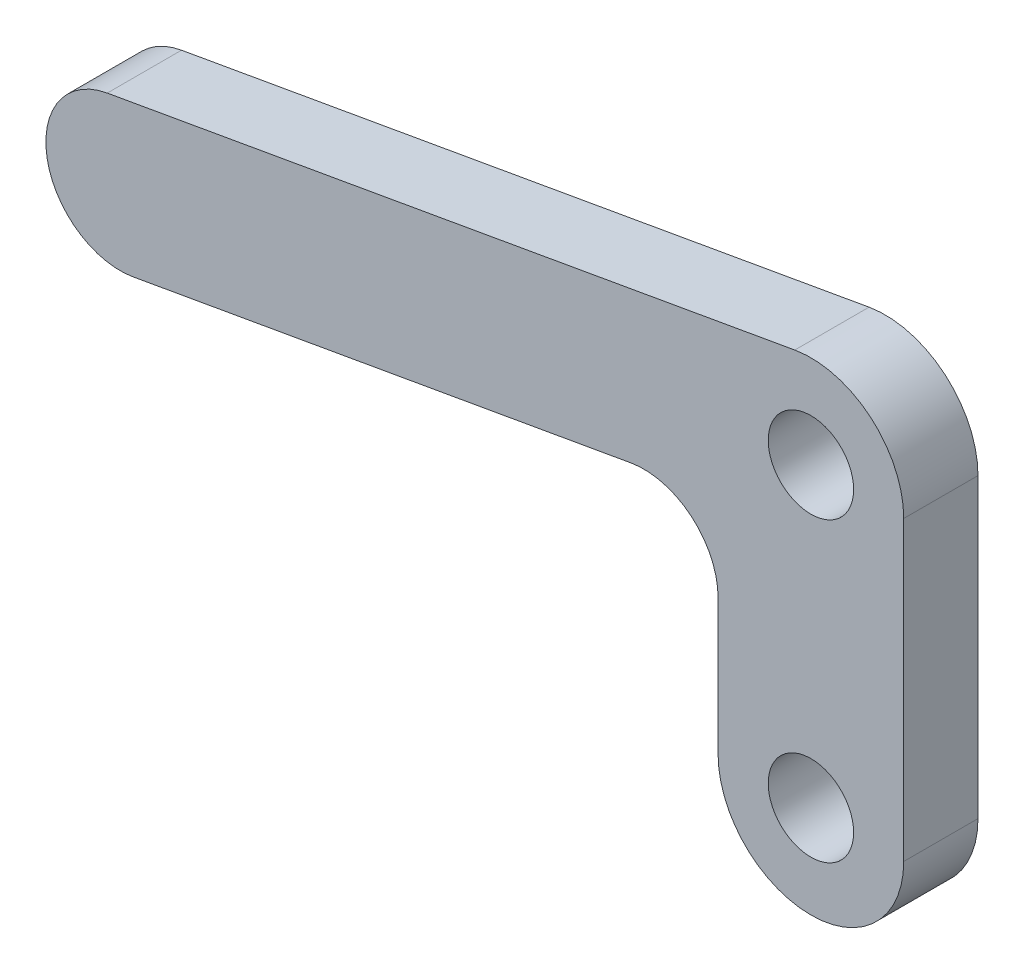
ISO-10303-21;
HEADER;
FILE_DESCRIPTION(('STEP AP214'),'2;1');
FILE_NAME('part.step','',(''),(''),'','','');
FILE_SCHEMA(('AUTOMOTIVE_DESIGN { 1 0 10303 214 1 1 1 1 }'));
ENDSEC;
DATA;
#1=APPLICATION_CONTEXT('core data for automotive mechanical design processes');
#2=APPLICATION_PROTOCOL_DEFINITION('international standard','automotive_design',2000,#1);
#3=PRODUCT_CONTEXT('',#1,'mechanical');
#4=PRODUCT('Part','Part','',(#3));
#5=PRODUCT_RELATED_PRODUCT_CATEGORY('part','',(#4));
#6=PRODUCT_DEFINITION_FORMATION('','',#4);
#7=PRODUCT_DEFINITION_CONTEXT('part definition',#1,'design');
#8=PRODUCT_DEFINITION('design','',#6,#7);
#9=PRODUCT_DEFINITION_SHAPE('','',#8);
#10=(LENGTH_UNIT() NAMED_UNIT(*) SI_UNIT(.MILLI.,.METRE.));
#11=(NAMED_UNIT(*) PLANE_ANGLE_UNIT() SI_UNIT($,.RADIAN.));
#12=(NAMED_UNIT(*) SI_UNIT($,.STERADIAN.) SOLID_ANGLE_UNIT());
#13=UNCERTAINTY_MEASURE_WITH_UNIT(LENGTH_MEASURE(1.E-05),#10,'distance_accuracy_value','');
#14=(GEOMETRIC_REPRESENTATION_CONTEXT(3) GLOBAL_UNCERTAINTY_ASSIGNED_CONTEXT((#13)) GLOBAL_UNIT_ASSIGNED_CONTEXT((#10,
#11,#12)) REPRESENTATION_CONTEXT('',''));
#15=CARTESIAN_POINT('',(0.,0.,0.));
#16=DIRECTION('',(0.,0.,1.));
#17=DIRECTION('',(1.,0.,0.));
#18=AXIS2_PLACEMENT_3D('',#15,#16,#17);
#19=CARTESIAN_POINT('',(-4.5,3.65253544521181,2.));
#20=DIRECTION('',(0.,0.,-1.));
#21=DIRECTION('',(-1.,0.,0.));
#22=AXIS2_PLACEMENT_3D('',#19,#20,#21);
#23=CYLINDRICAL_SURFACE('',#22,2.);
#24=CARTESIAN_POINT('',(-4.5,3.65253544521181,2.));
#25=DIRECTION('',(0.,0.,-1.));
#26=DIRECTION('',(1.,0.,0.));
#27=AXIS2_PLACEMENT_3D('',#24,#25,#26);
#28=CIRCLE('',#27,2.);
#29=CARTESIAN_POINT('',(-4.84729635533385,5.62215095123623,2.));
#30=VERTEX_POINT('',#29);
#31=CARTESIAN_POINT('',(-2.5,3.65253544521181,2.));
#32=VERTEX_POINT('',#31);
#33=EDGE_CURVE('E20',#30,#32,#28,.T.);
#34=ORIENTED_EDGE('',*,*,#33,.F.);
#35=DIRECTION('',(0.,0.,1.));
#36=VECTOR('',#35,1.);
#37=CARTESIAN_POINT('',(-4.84729635533385,5.62215095123623,2.));
#38=LINE('',#37,#36);
#39=CARTESIAN_POINT('',(-4.84729635533385,5.62215095123623,0.));
#40=VERTEX_POINT('',#39);
#41=EDGE_CURVE('E164',#40,#30,#38,.T.);
#42=ORIENTED_EDGE('',*,*,#41,.F.);
#43=CARTESIAN_POINT('',(-4.5,3.65253544521181,0.));
#44=DIRECTION('',(0.,0.,1.));
#45=DIRECTION('',(1.,0.,0.));
#46=AXIS2_PLACEMENT_3D('',#43,#44,#45);
#47=CIRCLE('',#46,2.);
#48=CARTESIAN_POINT('',(-2.5,3.65253544521181,0.));
#49=VERTEX_POINT('',#48);
#50=EDGE_CURVE('E11',#49,#40,#47,.T.);
#51=ORIENTED_EDGE('',*,*,#50,.F.);
#52=DIRECTION('',(0.,0.,-1.));
#53=VECTOR('',#52,1.);
#54=CARTESIAN_POINT('',(-2.5,3.65253544521181,2.));
#55=LINE('',#54,#53);
#56=EDGE_CURVE('E119',#32,#49,#55,.T.);
#57=ORIENTED_EDGE('',*,*,#56,.F.);
#58=EDGE_LOOP('',(#34,#42,#51,#57));
#59=FACE_BOUND('',#58,.T.);
#60=ADVANCED_FACE('F17',(#59),#23,.F.);
#61=CARTESIAN_POINT('',(0.,0.,0.));
#62=DIRECTION('',(0.,0.,1.));
#63=DIRECTION('',(1.,0.,0.));
#64=AXIS2_PLACEMENT_3D('',#61,#62,#63);
#65=PLANE('',#64);
#66=CARTESIAN_POINT('',(0.,0.,0.));
#67=DIRECTION('',(0.,0.,1.));
#68=DIRECTION('',(1.,0.,0.));
#69=AXIS2_PLACEMENT_3D('',#66,#67,#68);
#70=CIRCLE('',#69,1.15);
#71=CARTESIAN_POINT('',(1.15,0.,0.));
#72=VERTEX_POINT('',#71);
#73=EDGE_CURVE('E150',#72,#72,#70,.T.);
#74=ORIENTED_EDGE('',*,*,#73,.T.);
#75=EDGE_LOOP('',(#74));
#76=FACE_BOUND('',#75,.T.);
#77=CARTESIAN_POINT('',(0.,8.,0.));
#78=DIRECTION('',(0.,0.,1.));
#79=DIRECTION('',(1.,0.,0.));
#80=AXIS2_PLACEMENT_3D('',#77,#78,#79);
#81=CIRCLE('',#80,1.15);
#82=CARTESIAN_POINT('',(1.15,8.,0.));
#83=VERTEX_POINT('',#82);
#84=EDGE_CURVE('E148',#83,#83,#81,.T.);
#85=ORIENTED_EDGE('',*,*,#84,.T.);
#86=EDGE_LOOP('',(#85));
#87=FACE_BOUND('',#86,.T.);
#88=DIRECTION('',(0.984807753012209,0.173648177666926,0.));
#89=VECTOR('',#88,1.);
#90=CARTESIAN_POINT('',(-1.10760830680225,6.28155885362533,0.));
#91=LINE('',#90,#89);
#92=CARTESIAN_POINT('',(-18.2569240481954,3.25767178772941,0.));
#93=VERTEX_POINT('',#92);
#94=EDGE_CURVE('E161',#93,#40,#91,.T.);
#95=ORIENTED_EDGE('',*,*,#94,.F.);
#96=CARTESIAN_POINT('',(-18.6042204035292,5.22728729375383,0.));
#97=DIRECTION('',(0.,0.,-1.));
#98=DIRECTION('',(1.,0.,0.));
#99=AXIS2_PLACEMENT_3D('',#96,#97,#98);
#100=CIRCLE('',#99,2.);
#101=CARTESIAN_POINT('',(-18.9515167588631,7.19690279977825,0.));
#102=VERTEX_POINT('',#101);
#103=EDGE_CURVE('E216',#93,#102,#100,.T.);
#104=ORIENTED_EDGE('',*,*,#103,.T.);
#105=DIRECTION('',(-0.984807753012209,-0.173648177666926,0.));
#106=VECTOR('',#105,1.);
#107=CARTESIAN_POINT('',(-1.80220101746996,10.2207898656742,0.));
#108=LINE('',#107,#106);
#109=CARTESIAN_POINT('',(-0.434120444167319,10.4620193825305,0.));
#110=VERTEX_POINT('',#109);
#111=EDGE_CURVE('E154',#110,#102,#108,.T.);
#112=ORIENTED_EDGE('',*,*,#111,.F.);
#113=CARTESIAN_POINT('',(0.,8.,0.));
#114=DIRECTION('',(0.,0.,1.));
#115=DIRECTION('',(1.,0.,0.));
#116=AXIS2_PLACEMENT_3D('',#113,#114,#115);
#117=CIRCLE('',#116,2.5);
#118=CARTESIAN_POINT('',(2.5,8.,0.));
#119=VERTEX_POINT('',#118);
#120=EDGE_CURVE('E138',#119,#110,#117,.T.);
#121=ORIENTED_EDGE('',*,*,#120,.F.);
#122=DIRECTION('',(0.,1.,0.));
#123=VECTOR('',#122,1.);
#124=CARTESIAN_POINT('',(2.5,0.,0.));
#125=LINE('',#124,#123);
#126=CARTESIAN_POINT('',(2.5,0.,0.));
#127=VERTEX_POINT('',#126);
#128=EDGE_CURVE('E47',#127,#119,#125,.T.);
#129=ORIENTED_EDGE('',*,*,#128,.F.);
#130=CARTESIAN_POINT('',(0.,0.,0.));
#131=DIRECTION('',(0.,0.,1.));
#132=DIRECTION('',(1.,0.,0.));
#133=AXIS2_PLACEMENT_3D('',#130,#131,#132);
#134=CIRCLE('',#133,2.5);
#135=CARTESIAN_POINT('',(-2.5,0.,0.));
#136=VERTEX_POINT('',#135);
#137=EDGE_CURVE('E190',#136,#127,#134,.T.);
#138=ORIENTED_EDGE('',*,*,#137,.F.);
#139=DIRECTION('',(0.,1.,0.));
#140=VECTOR('',#139,1.);
#141=CARTESIAN_POINT('',(-2.5,0.,0.));
#142=LINE('',#141,#140);
#143=EDGE_CURVE('E124',#136,#49,#142,.T.);
#144=ORIENTED_EDGE('',*,*,#143,.T.);
#145=ORIENTED_EDGE('',*,*,#50,.T.);
#146=EDGE_LOOP('',(#95,#104,#112,#121,#129,#138,#144,#145));
#147=FACE_BOUND('',#146,.T.);
#148=ADVANCED_FACE('F225',(#76,#87,#147),#65,.F.);
#149=CARTESIAN_POINT('',(0.,0.,2.));
#150=DIRECTION('',(0.,0.,1.));
#151=DIRECTION('',(1.,0.,0.));
#152=AXIS2_PLACEMENT_3D('',#149,#150,#151);
#153=PLANE('',#152);
#154=CARTESIAN_POINT('',(0.,0.,2.));
#155=DIRECTION('',(0.,0.,1.));
#156=DIRECTION('',(1.,0.,0.));
#157=AXIS2_PLACEMENT_3D('',#154,#155,#156);
#158=CIRCLE('',#157,1.15);
#159=CARTESIAN_POINT('',(1.15,0.,2.));
#160=VERTEX_POINT('',#159);
#161=EDGE_CURVE('E318',#160,#160,#158,.T.);
#162=ORIENTED_EDGE('',*,*,#161,.F.);
#163=EDGE_LOOP('',(#162));
#164=FACE_BOUND('',#163,.T.);
#165=CARTESIAN_POINT('',(0.,8.,2.));
#166=DIRECTION('',(0.,0.,1.));
#167=DIRECTION('',(1.,0.,0.));
#168=AXIS2_PLACEMENT_3D('',#165,#166,#167);
#169=CIRCLE('',#168,1.15);
#170=CARTESIAN_POINT('',(1.15,8.,2.));
#171=VERTEX_POINT('',#170);
#172=EDGE_CURVE('E142',#171,#171,#169,.T.);
#173=ORIENTED_EDGE('',*,*,#172,.F.);
#174=EDGE_LOOP('',(#173));
#175=FACE_BOUND('',#174,.T.);
#176=DIRECTION('',(-0.984807753012209,-0.173648177666926,0.));
#177=VECTOR('',#176,1.);
#178=CARTESIAN_POINT('',(-1.80220101746996,10.2207898656742,2.));
#179=LINE('',#178,#177);
#180=CARTESIAN_POINT('',(-0.434120444167319,10.4620193825305,2.));
#181=VERTEX_POINT('',#180);
#182=CARTESIAN_POINT('',(-18.9515167588631,7.19690279977825,2.));
#183=VERTEX_POINT('',#182);
#184=EDGE_CURVE('E167',#181,#183,#179,.T.);
#185=ORIENTED_EDGE('',*,*,#184,.T.);
#186=CARTESIAN_POINT('',(-18.6042204035292,5.22728729375383,2.));
#187=DIRECTION('',(0.,0.,1.));
#188=DIRECTION('',(1.,0.,0.));
#189=AXIS2_PLACEMENT_3D('',#186,#187,#188);
#190=CIRCLE('',#189,2.);
#191=CARTESIAN_POINT('',(-18.2569240481954,3.25767178772941,2.));
#192=VERTEX_POINT('',#191);
#193=EDGE_CURVE('E215',#183,#192,#190,.T.);
#194=ORIENTED_EDGE('',*,*,#193,.T.);
#195=DIRECTION('',(0.984807753012209,0.173648177666926,0.));
#196=VECTOR('',#195,1.);
#197=CARTESIAN_POINT('',(-1.10760830680225,6.28155885362533,2.));
#198=LINE('',#197,#196);
#199=EDGE_CURVE('E115',#192,#30,#198,.T.);
#200=ORIENTED_EDGE('',*,*,#199,.T.);
#201=ORIENTED_EDGE('',*,*,#33,.T.);
#202=DIRECTION('',(0.,1.,0.));
#203=VECTOR('',#202,1.);
#204=CARTESIAN_POINT('',(-2.5,0.,2.));
#205=LINE('',#204,#203);
#206=CARTESIAN_POINT('',(-2.5,0.,2.));
#207=VERTEX_POINT('',#206);
#208=EDGE_CURVE('E109',#207,#32,#205,.T.);
#209=ORIENTED_EDGE('',*,*,#208,.F.);
#210=CARTESIAN_POINT('',(0.,0.,2.));
#211=DIRECTION('',(0.,0.,1.));
#212=DIRECTION('',(1.,0.,0.));
#213=AXIS2_PLACEMENT_3D('',#210,#211,#212);
#214=CIRCLE('',#213,2.5);
#215=CARTESIAN_POINT('',(2.5,0.,2.));
#216=VERTEX_POINT('',#215);
#217=EDGE_CURVE('E191',#207,#216,#214,.T.);
#218=ORIENTED_EDGE('',*,*,#217,.T.);
#219=DIRECTION('',(0.,1.,0.));
#220=VECTOR('',#219,1.);
#221=CARTESIAN_POINT('',(2.5,0.,2.));
#222=LINE('',#221,#220);
#223=CARTESIAN_POINT('',(2.5,8.,2.));
#224=VERTEX_POINT('',#223);
#225=EDGE_CURVE('E36',#216,#224,#222,.T.);
#226=ORIENTED_EDGE('',*,*,#225,.T.);
#227=CARTESIAN_POINT('',(0.,8.,2.));
#228=DIRECTION('',(0.,0.,1.));
#229=DIRECTION('',(1.,0.,0.));
#230=AXIS2_PLACEMENT_3D('',#227,#228,#229);
#231=CIRCLE('',#230,2.5);
#232=EDGE_CURVE('E156',#224,#181,#231,.T.);
#233=ORIENTED_EDGE('',*,*,#232,.T.);
#234=EDGE_LOOP('',(#185,#194,#200,#201,#209,#218,#226,#233));
#235=FACE_BOUND('',#234,.T.);
#236=ADVANCED_FACE('F107',(#164,#175,#235),#153,.T.);
#237=CARTESIAN_POINT('',(2.5,0.,2.));
#238=DIRECTION('',(-1.,0.,0.));
#239=DIRECTION('',(0.,0.,1.));
#240=AXIS2_PLACEMENT_3D('',#237,#238,#239);
#241=PLANE('',#240);
#242=ORIENTED_EDGE('',*,*,#128,.T.);
#243=DIRECTION('',(0.,0.,-1.));
#244=VECTOR('',#243,1.);
#245=CARTESIAN_POINT('',(2.5,8.,2.));
#246=LINE('',#245,#244);
#247=EDGE_CURVE('E151',#224,#119,#246,.T.);
#248=ORIENTED_EDGE('',*,*,#247,.F.);
#249=ORIENTED_EDGE('',*,*,#225,.F.);
#250=DIRECTION('',(0.,0.,-1.));
#251=VECTOR('',#250,1.);
#252=CARTESIAN_POINT('',(2.5,0.,2.));
#253=LINE('',#252,#251);
#254=EDGE_CURVE('E192',#216,#127,#253,.T.);
#255=ORIENTED_EDGE('',*,*,#254,.T.);
#256=EDGE_LOOP('',(#242,#248,#249,#255));
#257=FACE_BOUND('',#256,.T.);
#258=ADVANCED_FACE('F202',(#257),#241,.F.);
#259=CARTESIAN_POINT('',(0.,0.,2.));
#260=DIRECTION('',(0.,0.,-1.));
#261=DIRECTION('',(-1.,0.,0.));
#262=AXIS2_PLACEMENT_3D('',#259,#260,#261);
#263=CYLINDRICAL_SURFACE('',#262,2.5);
#264=ORIENTED_EDGE('',*,*,#137,.T.);
#265=ORIENTED_EDGE('',*,*,#254,.F.);
#266=ORIENTED_EDGE('',*,*,#217,.F.);
#267=DIRECTION('',(0.,0.,-1.));
#268=VECTOR('',#267,1.);
#269=CARTESIAN_POINT('',(-2.5,0.,2.));
#270=LINE('',#269,#268);
#271=EDGE_CURVE('E128',#207,#136,#270,.T.);
#272=ORIENTED_EDGE('',*,*,#271,.T.);
#273=EDGE_LOOP('',(#264,#265,#266,#272));
#274=FACE_BOUND('',#273,.T.);
#275=ADVANCED_FACE('F221',(#274),#263,.T.);
#276=CARTESIAN_POINT('',(-2.5,0.,2.));
#277=DIRECTION('',(-1.,0.,0.));
#278=DIRECTION('',(0.,0.,1.));
#279=AXIS2_PLACEMENT_3D('',#276,#277,#278);
#280=PLANE('',#279);
#281=ORIENTED_EDGE('',*,*,#208,.T.);
#282=ORIENTED_EDGE('',*,*,#56,.T.);
#283=ORIENTED_EDGE('',*,*,#143,.F.);
#284=ORIENTED_EDGE('',*,*,#271,.F.);
#285=EDGE_LOOP('',(#281,#282,#283,#284));
#286=FACE_BOUND('',#285,.T.);
#287=ADVANCED_FACE('F130',(#286),#280,.T.);
#288=CARTESIAN_POINT('',(-1.10760830680225,6.28155885362533,2.));
#289=DIRECTION('',(-0.173648177666926,0.984807753012209,0.));
#290=DIRECTION('',(0.,0.,1.));
#291=AXIS2_PLACEMENT_3D('',#288,#289,#290);
#292=PLANE('',#291);
#293=ORIENTED_EDGE('',*,*,#94,.T.);
#294=ORIENTED_EDGE('',*,*,#41,.T.);
#295=ORIENTED_EDGE('',*,*,#199,.F.);
#296=DIRECTION('',(0.,0.,-1.));
#297=VECTOR('',#296,1.);
#298=CARTESIAN_POINT('',(-18.2569240481954,3.25767178772942,2.));
#299=LINE('',#298,#297);
#300=EDGE_CURVE('E129',#192,#93,#299,.T.);
#301=ORIENTED_EDGE('',*,*,#300,.T.);
#302=EDGE_LOOP('',(#293,#294,#295,#301));
#303=FACE_BOUND('',#302,.T.);
#304=ADVANCED_FACE('F222',(#303),#292,.F.);
#305=CARTESIAN_POINT('',(-1.80220101746996,10.2207898656742,2.));
#306=DIRECTION('',(0.173648177666926,-0.984807753012209,0.));
#307=DIRECTION('',(0.,0.,-1.));
#308=AXIS2_PLACEMENT_3D('',#305,#306,#307);
#309=PLANE('',#308);
#310=ORIENTED_EDGE('',*,*,#111,.T.);
#311=DIRECTION('',(0.,0.,1.));
#312=VECTOR('',#311,1.);
#313=CARTESIAN_POINT('',(-18.9515167588631,7.19690279977825,2.));
#314=LINE('',#313,#312);
#315=EDGE_CURVE('E174',#102,#183,#314,.T.);
#316=ORIENTED_EDGE('',*,*,#315,.T.);
#317=ORIENTED_EDGE('',*,*,#184,.F.);
#318=DIRECTION('',(0.,0.,-1.));
#319=VECTOR('',#318,1.);
#320=CARTESIAN_POINT('',(-0.434120444167319,10.4620193825305,2.));
#321=LINE('',#320,#319);
#322=EDGE_CURVE('E160',#181,#110,#321,.T.);
#323=ORIENTED_EDGE('',*,*,#322,.T.);
#324=EDGE_LOOP('',(#310,#316,#317,#323));
#325=FACE_BOUND('',#324,.T.);
#326=ADVANCED_FACE('F209',(#325),#309,.F.);
#327=CARTESIAN_POINT('',(0.,8.,2.));
#328=DIRECTION('',(0.,0.,-1.));
#329=DIRECTION('',(-1.,0.,0.));
#330=AXIS2_PLACEMENT_3D('',#327,#328,#329);
#331=CYLINDRICAL_SURFACE('',#330,2.5);
#332=ORIENTED_EDGE('',*,*,#120,.T.);
#333=ORIENTED_EDGE('',*,*,#322,.F.);
#334=ORIENTED_EDGE('',*,*,#232,.F.);
#335=ORIENTED_EDGE('',*,*,#247,.T.);
#336=EDGE_LOOP('',(#332,#333,#334,#335));
#337=FACE_BOUND('',#336,.T.);
#338=ADVANCED_FACE('F208',(#337),#331,.T.);
#339=CARTESIAN_POINT('',(0.,8.,2.));
#340=DIRECTION('',(0.,0.,-1.));
#341=DIRECTION('',(-1.,0.,0.));
#342=AXIS2_PLACEMENT_3D('',#339,#340,#341);
#343=CYLINDRICAL_SURFACE('',#342,1.15);
#344=ORIENTED_EDGE('',*,*,#84,.F.);
#345=EDGE_LOOP('',(#344));
#346=FACE_BOUND('',#345,.T.);
#347=ORIENTED_EDGE('',*,*,#172,.T.);
#348=EDGE_LOOP('',(#347));
#349=FACE_BOUND('',#348,.T.);
#350=ADVANCED_FACE('F249',(#346,#349),#343,.F.);
#351=CARTESIAN_POINT('',(0.,0.,2.));
#352=DIRECTION('',(0.,0.,-1.));
#353=DIRECTION('',(-1.,0.,0.));
#354=AXIS2_PLACEMENT_3D('',#351,#352,#353);
#355=CYLINDRICAL_SURFACE('',#354,1.15);
#356=ORIENTED_EDGE('',*,*,#73,.F.);
#357=EDGE_LOOP('',(#356));
#358=FACE_BOUND('',#357,.T.);
#359=ORIENTED_EDGE('',*,*,#161,.T.);
#360=EDGE_LOOP('',(#359));
#361=FACE_BOUND('',#360,.T.);
#362=ADVANCED_FACE('F276',(#358,#361),#355,.F.);
#363=CARTESIAN_POINT('',(-18.6042204035292,5.22728729375383,2.));
#364=DIRECTION('',(0.,0.,-1.));
#365=DIRECTION('',(-1.,0.,0.));
#366=AXIS2_PLACEMENT_3D('',#363,#364,#365);
#367=CYLINDRICAL_SURFACE('',#366,2.);
#368=ORIENTED_EDGE('',*,*,#193,.F.);
#369=ORIENTED_EDGE('',*,*,#315,.F.);
#370=ORIENTED_EDGE('',*,*,#103,.F.);
#371=ORIENTED_EDGE('',*,*,#300,.F.);
#372=EDGE_LOOP('',(#368,#369,#370,#371));
#373=FACE_BOUND('',#372,.T.);
#374=ADVANCED_FACE('F217',(#373),#367,.T.);
#375=CLOSED_SHELL('',(#60,#148,#236,#258,#275,#287,#304,#326,#338,#350,#362,#374));
#376=MANIFOLD_SOLID_BREP('B1',#375);
#377=ADVANCED_BREP_SHAPE_REPRESENTATION('',(#18,#376),#14);
#378=SHAPE_DEFINITION_REPRESENTATION(#9,#377);
ENDSEC;
END-ISO-10303-21;
